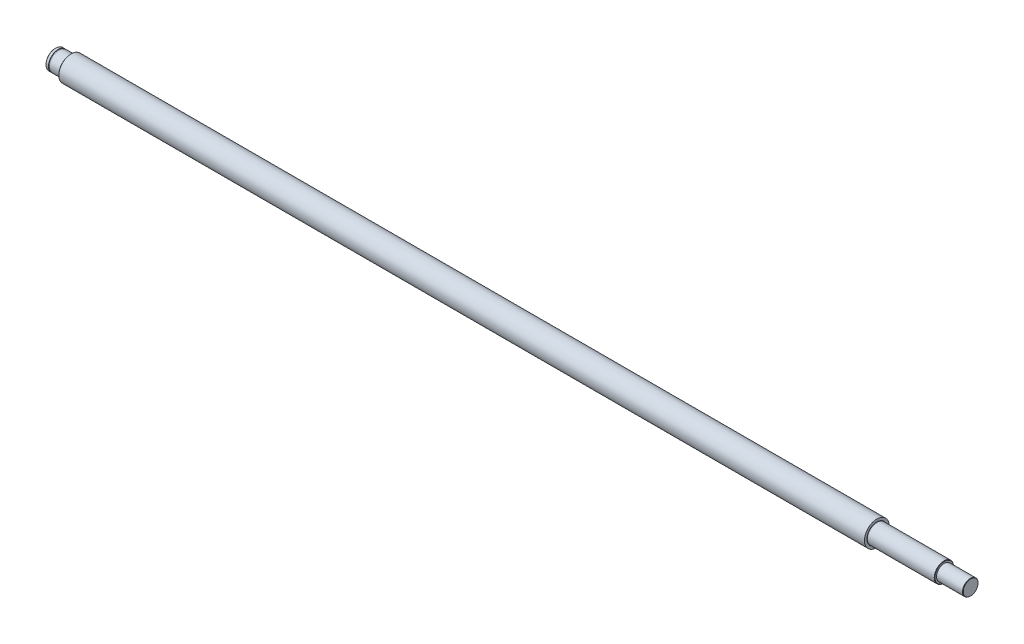
ISO-10303-21;
HEADER;
FILE_DESCRIPTION(('STEP AP214'),'2;1');
FILE_NAME('part.step','',(''),(''),'','','');
FILE_SCHEMA(('AUTOMOTIVE_DESIGN { 1 0 10303 214 1 1 1 1 }'));
ENDSEC;
DATA;
#1=APPLICATION_CONTEXT('core data for automotive mechanical design processes');
#2=APPLICATION_PROTOCOL_DEFINITION('international standard','automotive_design',2000,#1);
#3=PRODUCT_CONTEXT('',#1,'mechanical');
#4=PRODUCT('Part','Part','',(#3));
#5=PRODUCT_RELATED_PRODUCT_CATEGORY('part','',(#4));
#6=PRODUCT_DEFINITION_FORMATION('','',#4);
#7=PRODUCT_DEFINITION_CONTEXT('part definition',#1,'design');
#8=PRODUCT_DEFINITION('design','',#6,#7);
#9=PRODUCT_DEFINITION_SHAPE('','',#8);
#10=(LENGTH_UNIT() NAMED_UNIT(*) SI_UNIT(.MILLI.,.METRE.));
#11=(NAMED_UNIT(*) PLANE_ANGLE_UNIT() SI_UNIT($,.RADIAN.));
#12=(NAMED_UNIT(*) SI_UNIT($,.STERADIAN.) SOLID_ANGLE_UNIT());
#13=UNCERTAINTY_MEASURE_WITH_UNIT(LENGTH_MEASURE(1.E-05),#10,'distance_accuracy_value','');
#14=(GEOMETRIC_REPRESENTATION_CONTEXT(3) GLOBAL_UNCERTAINTY_ASSIGNED_CONTEXT((#13)) GLOBAL_UNIT_ASSIGNED_CONTEXT((#10,
#11,#12)) REPRESENTATION_CONTEXT('',''));
#15=CARTESIAN_POINT('',(0.,0.,0.));
#16=DIRECTION('',(0.,0.,1.));
#17=DIRECTION('',(1.,0.,0.));
#18=AXIS2_PLACEMENT_3D('',#15,#16,#17);
#19=CARTESIAN_POINT('',(0.,0.,0.));
#20=DIRECTION('',(1.,0.,0.));
#21=DIRECTION('',(0.,0.,-1.));
#22=AXIS2_PLACEMENT_3D('',#19,#20,#21);
#23=PLANE('',#22);
#24=CARTESIAN_POINT('',(0.,0.,0.));
#25=DIRECTION('',(1.,0.,0.));
#26=DIRECTION('',(0.,1.,0.));
#27=AXIS2_PLACEMENT_3D('',#24,#25,#26);
#28=CIRCLE('',#27,12.);
#29=CARTESIAN_POINT('',(0.,12.,0.));
#30=VERTEX_POINT('',#29);
#31=EDGE_CURVE('E17',#30,#30,#28,.T.);
#32=ORIENTED_EDGE('',*,*,#31,.F.);
#33=EDGE_LOOP('',(#32));
#34=FACE_BOUND('',#33,.T.);
#35=ADVANCED_FACE('F14',(#34),#23,.F.);
#36=CARTESIAN_POINT('',(0.499999999999945,0.,0.));
#37=DIRECTION('',(1.,0.,0.));
#38=DIRECTION('',(0.,1.,0.));
#39=AXIS2_PLACEMENT_3D('',#36,#37,#38);
#40=CONICAL_SURFACE('',#39,12.5,0.785398163397504);
#41=ORIENTED_EDGE('',*,*,#31,.T.);
#42=EDGE_LOOP('',(#41));
#43=FACE_BOUND('',#42,.T.);
#44=CARTESIAN_POINT('',(0.499999999999945,0.,0.));
#45=DIRECTION('',(-1.,0.,0.));
#46=DIRECTION('',(0.,0.,1.));
#47=AXIS2_PLACEMENT_3D('',#44,#45,#46);
#48=CIRCLE('',#47,12.5);
#49=CARTESIAN_POINT('',(0.499999999999945,0.,12.5));
#50=VERTEX_POINT('',#49);
#51=EDGE_CURVE('E124',#50,#50,#48,.F.);
#52=ORIENTED_EDGE('',*,*,#51,.F.);
#53=EDGE_LOOP('',(#52));
#54=FACE_BOUND('',#53,.T.);
#55=ADVANCED_FACE('F154',(#43,#54),#40,.T.);
#56=CARTESIAN_POINT('',(1181.,9.5,0.));
#57=DIRECTION('',(-1.,0.,0.));
#58=DIRECTION('',(0.,0.,1.));
#59=AXIS2_PLACEMENT_3D('',#56,#57,#58);
#60=PLANE('',#59);
#61=CARTESIAN_POINT('',(1181.,0.,0.));
#62=DIRECTION('',(-1.,0.,0.));
#63=DIRECTION('',(0.,0.,1.));
#64=AXIS2_PLACEMENT_3D('',#61,#62,#63);
#65=CIRCLE('',#64,9.5);
#66=CARTESIAN_POINT('',(1181.,0.,9.5));
#67=VERTEX_POINT('',#66);
#68=EDGE_CURVE('E127',#67,#67,#65,.T.);
#69=ORIENTED_EDGE('',*,*,#68,.F.);
#70=EDGE_LOOP('',(#69));
#71=FACE_BOUND('',#70,.T.);
#72=ADVANCED_FACE('F151',(#71),#60,.F.);
#73=CARTESIAN_POINT('',(1181.,0.,0.));
#74=DIRECTION('',(-1.,0.,0.));
#75=DIRECTION('',(0.,0.,1.));
#76=AXIS2_PLACEMENT_3D('',#73,#74,#75);
#77=CYLINDRICAL_SURFACE('',#76,12.5);
#78=ORIENTED_EDGE('',*,*,#51,.T.);
#79=EDGE_LOOP('',(#78));
#80=FACE_BOUND('',#79,.T.);
#81=CARTESIAN_POINT('',(3.64999999999993,0.,0.));
#82=DIRECTION('',(-1.,0.,0.));
#83=DIRECTION('',(0.,0.,1.));
#84=AXIS2_PLACEMENT_3D('',#81,#82,#83);
#85=CIRCLE('',#84,12.5);
#86=CARTESIAN_POINT('',(3.64999999999993,0.,12.5));
#87=VERTEX_POINT('',#86);
#88=EDGE_CURVE('E121',#87,#87,#85,.T.);
#89=ORIENTED_EDGE('',*,*,#88,.T.);
#90=EDGE_LOOP('',(#89));
#91=FACE_BOUND('',#90,.T.);
#92=ADVANCED_FACE('F153',(#80,#91),#77,.T.);
#93=CARTESIAN_POINT('',(1180.5,0.,0.));
#94=DIRECTION('',(-1.,0.,0.));
#95=DIRECTION('',(0.,0.,1.));
#96=AXIS2_PLACEMENT_3D('',#93,#94,#95);
#97=CONICAL_SURFACE('',#96,10.,0.785398163397504);
#98=CARTESIAN_POINT('',(1180.5,0.,0.));
#99=DIRECTION('',(-1.,0.,0.));
#100=DIRECTION('',(0.,0.,1.));
#101=AXIS2_PLACEMENT_3D('',#98,#99,#100);
#102=CIRCLE('',#101,10.);
#103=CARTESIAN_POINT('',(1180.5,0.,10.));
#104=VERTEX_POINT('',#103);
#105=EDGE_CURVE('E117',#104,#104,#102,.T.);
#106=ORIENTED_EDGE('',*,*,#105,.F.);
#107=EDGE_LOOP('',(#106));
#108=FACE_BOUND('',#107,.T.);
#109=ORIENTED_EDGE('',*,*,#68,.T.);
#110=EDGE_LOOP('',(#109));
#111=FACE_BOUND('',#110,.T.);
#112=ADVANCED_FACE('F149',(#108,#111),#97,.T.);
#113=CARTESIAN_POINT('',(3.65,12.5,0.));
#114=DIRECTION('',(-1.,0.,0.));
#115=DIRECTION('',(0.,0.,1.));
#116=AXIS2_PLACEMENT_3D('',#113,#114,#115);
#117=PLANE('',#116);
#118=ORIENTED_EDGE('',*,*,#88,.F.);
#119=EDGE_LOOP('',(#118));
#120=FACE_BOUND('',#119,.T.);
#121=CARTESIAN_POINT('',(3.64999999999993,0.,0.));
#122=DIRECTION('',(-1.,0.,0.));
#123=DIRECTION('',(0.,0.,1.));
#124=AXIS2_PLACEMENT_3D('',#121,#122,#123);
#125=CIRCLE('',#124,11.95);
#126=CARTESIAN_POINT('',(3.64999999999993,0.,11.95));
#127=VERTEX_POINT('',#126);
#128=EDGE_CURVE('E120',#127,#127,#125,.F.);
#129=ORIENTED_EDGE('',*,*,#128,.F.);
#130=EDGE_LOOP('',(#129));
#131=FACE_BOUND('',#130,.T.);
#132=ADVANCED_FACE('F248',(#120,#131),#117,.F.);
#133=CARTESIAN_POINT('',(1181.,0.,0.));
#134=DIRECTION('',(-1.,0.,0.));
#135=DIRECTION('',(0.,0.,1.));
#136=AXIS2_PLACEMENT_3D('',#133,#134,#135);
#137=CYLINDRICAL_SURFACE('',#136,10.);
#138=CARTESIAN_POINT('',(1147.,0.,0.));
#139=DIRECTION('',(-1.,0.,0.));
#140=DIRECTION('',(0.,0.,1.));
#141=AXIS2_PLACEMENT_3D('',#138,#139,#140);
#142=CIRCLE('',#141,10.);
#143=CARTESIAN_POINT('',(1147.,0.,10.));
#144=VERTEX_POINT('',#143);
#145=EDGE_CURVE('E140',#144,#144,#142,.F.);
#146=ORIENTED_EDGE('',*,*,#145,.T.);
#147=EDGE_LOOP('',(#146));
#148=FACE_BOUND('',#147,.T.);
#149=ORIENTED_EDGE('',*,*,#105,.T.);
#150=EDGE_LOOP('',(#149));
#151=FACE_BOUND('',#150,.T.);
#152=ADVANCED_FACE('F240',(#148,#151),#137,.T.);
#153=CARTESIAN_POINT('',(1181.,0.,0.));
#154=DIRECTION('',(-1.,0.,0.));
#155=DIRECTION('',(0.,0.,1.));
#156=AXIS2_PLACEMENT_3D('',#153,#154,#155);
#157=CYLINDRICAL_SURFACE('',#156,11.95);
#158=ORIENTED_EDGE('',*,*,#128,.T.);
#159=EDGE_LOOP('',(#158));
#160=FACE_BOUND('',#159,.T.);
#161=CARTESIAN_POINT('',(4.99999999999989,0.,0.));
#162=DIRECTION('',(-1.,0.,0.));
#163=DIRECTION('',(0.,0.,1.));
#164=AXIS2_PLACEMENT_3D('',#161,#162,#163);
#165=CIRCLE('',#164,11.95);
#166=CARTESIAN_POINT('',(4.99999999999989,0.,11.95));
#167=VERTEX_POINT('',#166);
#168=EDGE_CURVE('E137',#167,#167,#165,.T.);
#169=ORIENTED_EDGE('',*,*,#168,.T.);
#170=EDGE_LOOP('',(#169));
#171=FACE_BOUND('',#170,.T.);
#172=ADVANCED_FACE('F232',(#160,#171),#157,.T.);
#173=CARTESIAN_POINT('',(1147.,12.,0.));
#174=DIRECTION('',(-1.,0.,0.));
#175=DIRECTION('',(0.,0.,1.));
#176=AXIS2_PLACEMENT_3D('',#173,#174,#175);
#177=PLANE('',#176);
#178=CARTESIAN_POINT('',(1147.,0.,0.));
#179=DIRECTION('',(-1.,0.,0.));
#180=DIRECTION('',(0.,0.,1.));
#181=AXIS2_PLACEMENT_3D('',#178,#179,#180);
#182=CIRCLE('',#181,12.);
#183=CARTESIAN_POINT('',(1147.,0.,12.));
#184=VERTEX_POINT('',#183);
#185=EDGE_CURVE('E134',#184,#184,#182,.T.);
#186=ORIENTED_EDGE('',*,*,#185,.F.);
#187=EDGE_LOOP('',(#186));
#188=FACE_BOUND('',#187,.T.);
#189=ORIENTED_EDGE('',*,*,#145,.F.);
#190=EDGE_LOOP('',(#189));
#191=FACE_BOUND('',#190,.T.);
#192=ADVANCED_FACE('F224',(#188,#191),#177,.F.);
#193=CARTESIAN_POINT('',(5.,11.95,0.));
#194=DIRECTION('',(1.,0.,0.));
#195=DIRECTION('',(0.,0.,-1.));
#196=AXIS2_PLACEMENT_3D('',#193,#194,#195);
#197=PLANE('',#196);
#198=ORIENTED_EDGE('',*,*,#168,.F.);
#199=EDGE_LOOP('',(#198));
#200=FACE_BOUND('',#199,.T.);
#201=CARTESIAN_POINT('',(4.99999999999989,0.,0.));
#202=DIRECTION('',(-1.,0.,0.));
#203=DIRECTION('',(0.,0.,1.));
#204=AXIS2_PLACEMENT_3D('',#201,#202,#203);
#205=CIRCLE('',#204,12.5);
#206=CARTESIAN_POINT('',(4.99999999999989,0.,12.5));
#207=VERTEX_POINT('',#206);
#208=EDGE_CURVE('E114',#207,#207,#205,.F.);
#209=ORIENTED_EDGE('',*,*,#208,.F.);
#210=EDGE_LOOP('',(#209));
#211=FACE_BOUND('',#210,.T.);
#212=ADVANCED_FACE('F216',(#200,#211),#197,.F.);
#213=CARTESIAN_POINT('',(1146.5,0.,0.));
#214=DIRECTION('',(-1.,0.,0.));
#215=DIRECTION('',(0.,0.,1.));
#216=AXIS2_PLACEMENT_3D('',#213,#214,#215);
#217=CONICAL_SURFACE('',#216,12.5,0.785398163397504);
#218=CARTESIAN_POINT('',(1146.5,0.,0.));
#219=DIRECTION('',(-1.,0.,0.));
#220=DIRECTION('',(0.,0.,1.));
#221=AXIS2_PLACEMENT_3D('',#218,#219,#220);
#222=CIRCLE('',#221,12.5);
#223=CARTESIAN_POINT('',(1146.5,0.,12.5));
#224=VERTEX_POINT('',#223);
#225=EDGE_CURVE('E106',#224,#224,#222,.T.);
#226=ORIENTED_EDGE('',*,*,#225,.F.);
#227=EDGE_LOOP('',(#226));
#228=FACE_BOUND('',#227,.T.);
#229=ORIENTED_EDGE('',*,*,#185,.T.);
#230=EDGE_LOOP('',(#229));
#231=FACE_BOUND('',#230,.T.);
#232=ADVANCED_FACE('F209',(#228,#231),#217,.T.);
#233=CARTESIAN_POINT('',(1181.,0.,0.));
#234=DIRECTION('',(-1.,0.,0.));
#235=DIRECTION('',(0.,0.,1.));
#236=AXIS2_PLACEMENT_3D('',#233,#234,#235);
#237=CYLINDRICAL_SURFACE('',#236,12.5);
#238=ORIENTED_EDGE('',*,*,#208,.T.);
#239=EDGE_LOOP('',(#238));
#240=FACE_BOUND('',#239,.T.);
#241=CARTESIAN_POINT('',(19.5000000000001,0.,0.));
#242=DIRECTION('',(1.,0.,0.));
#243=DIRECTION('',(0.,0.,-1.));
#244=AXIS2_PLACEMENT_3D('',#241,#242,#243);
#245=CIRCLE('',#244,12.5);
#246=CARTESIAN_POINT('',(19.5000000000001,0.,-12.5));
#247=VERTEX_POINT('',#246);
#248=EDGE_CURVE('E77',#247,#247,#245,.F.);
#249=ORIENTED_EDGE('',*,*,#248,.T.);
#250=EDGE_LOOP('',(#249));
#251=FACE_BOUND('',#250,.T.);
#252=ADVANCED_FACE('F202',(#240,#251),#237,.T.);
#253=CARTESIAN_POINT('',(1181.,0.,0.));
#254=DIRECTION('',(-1.,0.,0.));
#255=DIRECTION('',(0.,0.,1.));
#256=AXIS2_PLACEMENT_3D('',#253,#254,#255);
#257=CYLINDRICAL_SURFACE('',#256,12.5);
#258=CARTESIAN_POINT('',(1060.3,0.,0.));
#259=DIRECTION('',(1.,0.,0.));
#260=DIRECTION('',(0.,0.,-1.));
#261=AXIS2_PLACEMENT_3D('',#258,#259,#260);
#262=CIRCLE('',#261,12.5000000000001);
#263=CARTESIAN_POINT('',(1060.3,0.,-12.5000000000001));
#264=VERTEX_POINT('',#263);
#265=EDGE_CURVE('E73',#264,#264,#262,.T.);
#266=ORIENTED_EDGE('',*,*,#265,.T.);
#267=EDGE_LOOP('',(#266));
#268=FACE_BOUND('',#267,.T.);
#269=ORIENTED_EDGE('',*,*,#225,.T.);
#270=EDGE_LOOP('',(#269));
#271=FACE_BOUND('',#270,.T.);
#272=ADVANCED_FACE('F97',(#268,#271),#257,.T.);
#273=CARTESIAN_POINT('',(19.5,0.,0.));
#274=DIRECTION('',(1.,0.,0.));
#275=DIRECTION('',(0.,0.,-1.));
#276=AXIS2_PLACEMENT_3D('',#273,#274,#275);
#277=TOROIDAL_SURFACE('',#276,13.,0.500000000000002);
#278=ORIENTED_EDGE('',*,*,#248,.F.);
#279=EDGE_LOOP('',(#278));
#280=FACE_BOUND('',#279,.T.);
#281=CARTESIAN_POINT('',(20.,0.,0.));
#282=DIRECTION('',(-1.,0.,0.));
#283=DIRECTION('',(0.,0.,-1.));
#284=AXIS2_PLACEMENT_3D('',#281,#282,#283);
#285=CIRCLE('',#284,13.);
#286=CARTESIAN_POINT('',(20.,0.,-13.));
#287=VERTEX_POINT('',#286);
#288=EDGE_CURVE('E76',#287,#287,#285,.T.);
#289=ORIENTED_EDGE('',*,*,#288,.T.);
#290=EDGE_LOOP('',(#289));
#291=FACE_BOUND('',#290,.T.);
#292=ADVANCED_FACE('F93',(#280,#291),#277,.F.);
#293=CARTESIAN_POINT('',(1060.3,0.,0.));
#294=DIRECTION('',(1.,0.,0.));
#295=DIRECTION('',(0.,0.,-1.));
#296=AXIS2_PLACEMENT_3D('',#293,#294,#295);
#297=TOROIDAL_SURFACE('',#296,12.8000000000003,0.300000000000189);
#298=CARTESIAN_POINT('',(1060.,0.,0.));
#299=DIRECTION('',(1.,0.,0.));
#300=DIRECTION('',(0.,0.,-1.));
#301=AXIS2_PLACEMENT_3D('',#298,#299,#300);
#302=CIRCLE('',#301,12.8);
#303=CARTESIAN_POINT('',(1060.,0.,-12.8));
#304=VERTEX_POINT('',#303);
#305=EDGE_CURVE('E35',#304,#304,#302,.T.);
#306=ORIENTED_EDGE('',*,*,#305,.T.);
#307=EDGE_LOOP('',(#306));
#308=FACE_BOUND('',#307,.T.);
#309=ORIENTED_EDGE('',*,*,#265,.F.);
#310=EDGE_LOOP('',(#309));
#311=FACE_BOUND('',#310,.T.);
#312=ADVANCED_FACE('F59',(#308,#311),#297,.F.);
#313=CARTESIAN_POINT('',(20.,13.,0.));
#314=DIRECTION('',(1.,0.,0.));
#315=DIRECTION('',(0.,0.,-1.));
#316=AXIS2_PLACEMENT_3D('',#313,#314,#315);
#317=PLANE('',#316);
#318=ORIENTED_EDGE('',*,*,#288,.F.);
#319=EDGE_LOOP('',(#318));
#320=FACE_BOUND('',#319,.T.);
#321=CARTESIAN_POINT('',(20.,0.,0.));
#322=DIRECTION('',(1.,0.,0.));
#323=DIRECTION('',(0.,0.,-1.));
#324=AXIS2_PLACEMENT_3D('',#321,#322,#323);
#325=CIRCLE('',#324,15.5);
#326=CARTESIAN_POINT('',(20.,0.,-15.5));
#327=VERTEX_POINT('',#326);
#328=EDGE_CURVE('E26',#327,#327,#325,.T.);
#329=ORIENTED_EDGE('',*,*,#328,.F.);
#330=EDGE_LOOP('',(#329));
#331=FACE_BOUND('',#330,.T.);
#332=ADVANCED_FACE('F53',(#320,#331),#317,.F.);
#333=CARTESIAN_POINT('',(1060.,16.,0.));
#334=DIRECTION('',(-1.,0.,0.));
#335=DIRECTION('',(0.,0.,1.));
#336=AXIS2_PLACEMENT_3D('',#333,#334,#335);
#337=PLANE('',#336);
#338=CARTESIAN_POINT('',(1060.,0.,0.));
#339=DIRECTION('',(-1.,0.,0.));
#340=DIRECTION('',(0.,0.,1.));
#341=AXIS2_PLACEMENT_3D('',#338,#339,#340);
#342=CIRCLE('',#341,16.);
#343=CARTESIAN_POINT('',(1060.,0.,16.));
#344=VERTEX_POINT('',#343);
#345=EDGE_CURVE('E21',#344,#344,#342,.T.);
#346=ORIENTED_EDGE('',*,*,#345,.F.);
#347=EDGE_LOOP('',(#346));
#348=FACE_BOUND('',#347,.T.);
#349=ORIENTED_EDGE('',*,*,#305,.F.);
#350=EDGE_LOOP('',(#349));
#351=FACE_BOUND('',#350,.T.);
#352=ADVANCED_FACE('F42',(#348,#351),#337,.F.);
#353=CARTESIAN_POINT('',(20.5,0.,0.));
#354=DIRECTION('',(1.,0.,0.));
#355=DIRECTION('',(0.,0.,-1.));
#356=AXIS2_PLACEMENT_3D('',#353,#354,#355);
#357=CONICAL_SURFACE('',#356,16.,0.785398163397504);
#358=ORIENTED_EDGE('',*,*,#328,.T.);
#359=EDGE_LOOP('',(#358));
#360=FACE_BOUND('',#359,.T.);
#361=CARTESIAN_POINT('',(20.5,0.,0.));
#362=DIRECTION('',(-1.,0.,0.));
#363=DIRECTION('',(0.,0.,1.));
#364=AXIS2_PLACEMENT_3D('',#361,#362,#363);
#365=CIRCLE('',#364,16.);
#366=CARTESIAN_POINT('',(20.5,0.,16.));
#367=VERTEX_POINT('',#366);
#368=EDGE_CURVE('E10',#367,#367,#365,.F.);
#369=ORIENTED_EDGE('',*,*,#368,.F.);
#370=EDGE_LOOP('',(#369));
#371=FACE_BOUND('',#370,.T.);
#372=ADVANCED_FACE('F52',(#360,#371),#357,.T.);
#373=CARTESIAN_POINT('',(1181.,0.,0.));
#374=DIRECTION('',(-1.,0.,0.));
#375=DIRECTION('',(0.,0.,1.));
#376=AXIS2_PLACEMENT_3D('',#373,#374,#375);
#377=CYLINDRICAL_SURFACE('',#376,16.);
#378=ORIENTED_EDGE('',*,*,#368,.T.);
#379=EDGE_LOOP('',(#378));
#380=FACE_BOUND('',#379,.T.);
#381=ORIENTED_EDGE('',*,*,#345,.T.);
#382=EDGE_LOOP('',(#381));
#383=FACE_BOUND('',#382,.T.);
#384=ADVANCED_FACE('F164',(#380,#383),#377,.T.);
#385=CLOSED_SHELL('',(#35,#55,#72,#92,#112,#132,#152,#172,#192,#212,#232,#252,#272,#292,#312,
#332,#352,#372,#384));
#386=MANIFOLD_SOLID_BREP('B1',#385);
#387=ADVANCED_BREP_SHAPE_REPRESENTATION('',(#18,#386),#14);
#388=SHAPE_DEFINITION_REPRESENTATION(#9,#387);
ENDSEC;
END-ISO-10303-21;
